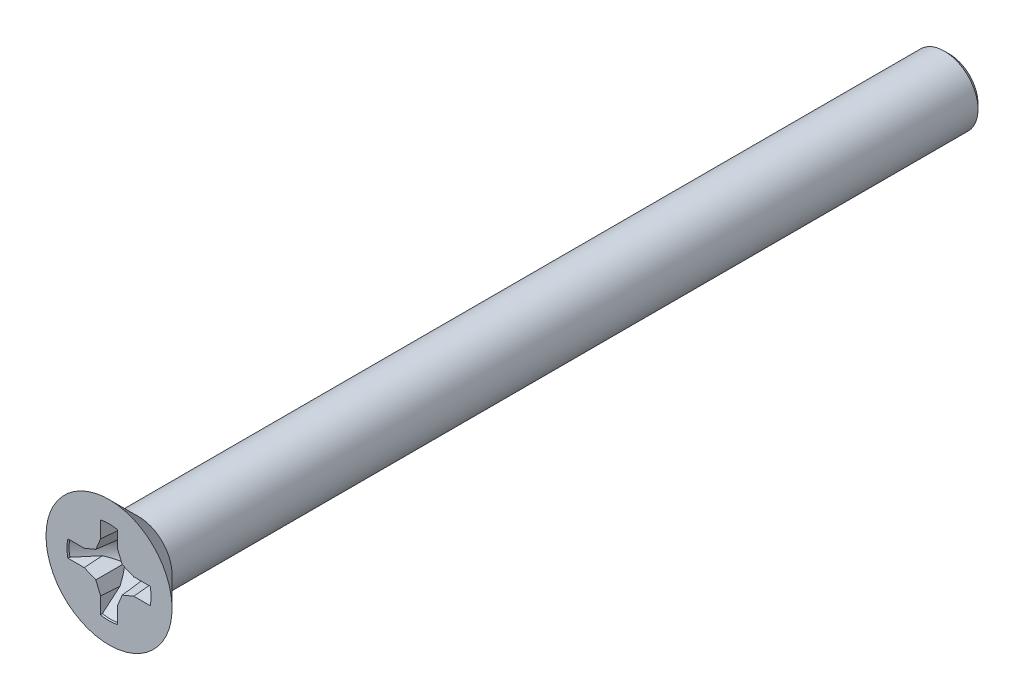
ISO-10303-21;
HEADER;
FILE_DESCRIPTION(('STEP AP214'),'2;1');
FILE_NAME('part.step','',(''),(''),'','','');
FILE_SCHEMA(('AUTOMOTIVE_DESIGN { 1 0 10303 214 1 1 1 1 }'));
ENDSEC;
DATA;
#1=APPLICATION_CONTEXT('core data for automotive mechanical design processes');
#2=APPLICATION_PROTOCOL_DEFINITION('international standard','automotive_design',2000,#1);
#3=PRODUCT_CONTEXT('',#1,'mechanical');
#4=PRODUCT('Part','Part','',(#3));
#5=PRODUCT_RELATED_PRODUCT_CATEGORY('part','',(#4));
#6=PRODUCT_DEFINITION_FORMATION('','',#4);
#7=PRODUCT_DEFINITION_CONTEXT('part definition',#1,'design');
#8=PRODUCT_DEFINITION('design','',#6,#7);
#9=PRODUCT_DEFINITION_SHAPE('','',#8);
#10=(LENGTH_UNIT() NAMED_UNIT(*) SI_UNIT(.MILLI.,.METRE.));
#11=(NAMED_UNIT(*) PLANE_ANGLE_UNIT() SI_UNIT($,.RADIAN.));
#12=(NAMED_UNIT(*) SI_UNIT($,.STERADIAN.) SOLID_ANGLE_UNIT());
#13=UNCERTAINTY_MEASURE_WITH_UNIT(LENGTH_MEASURE(1.E-05),#10,'distance_accuracy_value','');
#14=(GEOMETRIC_REPRESENTATION_CONTEXT(3) GLOBAL_UNCERTAINTY_ASSIGNED_CONTEXT((#13)) GLOBAL_UNIT_ASSIGNED_CONTEXT((#10,
#11,#12)) REPRESENTATION_CONTEXT('',''));
#15=CARTESIAN_POINT('',(0.,0.,0.));
#16=DIRECTION('',(0.,0.,1.));
#17=DIRECTION('',(1.,0.,0.));
#18=AXIS2_PLACEMENT_3D('',#15,#16,#17);
#19=CARTESIAN_POINT('',(0.500000000000026,-2.44948974278317,2.2));
#20=DIRECTION('',(-0.996194698091746,0.,0.0871557427476584));
#21=DIRECTION('',(0.,1.,0.));
#22=AXIS2_PLACEMENT_3D('',#19,#20,#21);
#23=PLANE('',#22);
#24=CARTESIAN_POINT('',(0.407324383999236,-1.45631054521119,1.14071286192047));
#25=CARTESIAN_POINT('',(0.438895455571679,-1.82218846608027,1.50157186124767));
#26=CARTESIAN_POINT('',(0.491456261529248,-2.42452511645569,2.1023446224179));
#27=(BOUNDED_CURVE() B_SPLINE_CURVE(2,(#24,#25,#26),.UNSPECIFIED.,.F.,
.F.) B_SPLINE_CURVE_WITH_KNOTS((3,3),(-0.0502307633060338,-0.0167180936561359),
.UNSPECIFIED.) CURVE() GEOMETRIC_REPRESENTATION_ITEM() RATIONAL_B_SPLINE_CURVE((2.16666900214285,
1.79889986437871,1.40255352692601)) REPRESENTATION_ITEM(''));
#28=CARTESIAN_POINT('',(0.407324383999526,-1.45631054521456,1.14071286192379));
#29=VERTEX_POINT('',#28);
#30=CARTESIAN_POINT('',(0.491456261529248,-2.42452511645569,2.1023446224179));
#31=VERTEX_POINT('',#30);
#32=EDGE_CURVE('E250',#29,#31,#27,.T.);
#33=ORIENTED_EDGE('',*,*,#32,.T.);
#34=DIRECTION('',(0.0844599239044589,-0.246790143112909,0.965381347715172));
#35=VECTOR('',#34,1.);
#36=CARTESIAN_POINT('',(0.491456261529248,-2.42452511645569,2.1023446224179));
#37=LINE('',#36,#35);
#38=CARTESIAN_POINT('',(0.500000000000026,-2.44948974278317,2.2));
#39=VERTEX_POINT('',#38);
#40=EDGE_CURVE('E316',#31,#39,#37,.T.);
#41=ORIENTED_EDGE('',*,*,#40,.T.);
#42=DIRECTION('',(0.,1.,0.));
#43=VECTOR('',#42,1.);
#44=CARTESIAN_POINT('',(0.500000000000026,-2.44948974278317,2.2));
#45=LINE('',#44,#43);
#46=CARTESIAN_POINT('',(0.500000000000016,-1.47474487139158,2.2));
#47=VERTEX_POINT('',#46);
#48=EDGE_CURVE('E265',#39,#47,#45,.T.);
#49=ORIENTED_EDGE('',*,*,#48,.T.);
#50=DIRECTION('',(0.0871426484044399,-0.0173337504938593,0.996045029063886));
#51=VECTOR('',#50,1.);
#52=CARTESIAN_POINT('',(0.500000000000016,-1.47474487139158,2.2));
#53=LINE('',#52,#51);
#54=EDGE_CURVE('E10',#29,#47,#53,.T.);
#55=ORIENTED_EDGE('',*,*,#54,.F.);
#56=EDGE_LOOP('',(#33,#41,#49,#55));
#57=FACE_BOUND('',#56,.T.);
#58=ADVANCED_FACE('F16',(#57),#23,.T.);
#59=CARTESIAN_POINT('',(0.500000000000016,-1.47474487139158,2.2));
#60=DIRECTION('',(-0.920363891963228,0.381227206369644,0.0871557427476583));
#61=DIRECTION('',(0.0942752822069814,0.,0.995546167269401));
#62=AXIS2_PLACEMENT_3D('',#59,#60,#61);
#63=PLANE('',#62);
#64=CARTESIAN_POINT('',(0.677460402999254,-0.677460402997918,0.58658499186893));
#65=CARTESIAN_POINT('',(0.568014544026815,-0.971532360593278,0.717135358188932));
#66=CARTESIAN_POINT('',(0.40732438399968,-1.4563105452141,1.14071286192338));
#67=(BOUNDED_CURVE() B_SPLINE_CURVE(2,(#64,#65,#66),.UNSPECIFIED.,.F.,
.F.) B_SPLINE_CURVE_WITH_KNOTS((3,3),(-0.314713883632195,-0.142510550070693),
.UNSPECIFIED.) CURVE() GEOMETRIC_REPRESENTATION_ITEM() RATIONAL_B_SPLINE_CURVE((2.54190043462429,
2.36011495061725,1.91562167133786)) REPRESENTATION_ITEM(''));
#68=CARTESIAN_POINT('',(0.677460402998895,-0.677460402998881,0.586584991869358));
#69=VERTEX_POINT('',#68);
#70=EDGE_CURVE('E255',#69,#29,#67,.T.);
#71=ORIENTED_EDGE('',*,*,#70,.T.);
#72=ORIENTED_EDGE('',*,*,#54,.T.);
#73=DIRECTION('',(0.38268343236508,0.923879532511291,0.));
#74=VECTOR('',#73,1.);
#75=CARTESIAN_POINT('',(0.500000000000016,-1.47474487139158,2.2));
#76=LINE('',#75,#74);
#77=CARTESIAN_POINT('',(0.785496162903796,-0.785496162903779,2.2));
#78=VERTEX_POINT('',#77);
#79=EDGE_CURVE('E270',#47,#78,#76,.T.);
#80=ORIENTED_EDGE('',*,*,#79,.T.);
#81=DIRECTION('',(0.066662691346833,-0.0666626913468316,0.995546167269401));
#82=VECTOR('',#81,1.);
#83=CARTESIAN_POINT('',(0.785496162903796,-0.785496162903779,2.2));
#84=LINE('',#83,#82);
#85=EDGE_CURVE('E27',#69,#78,#84,.T.);
#86=ORIENTED_EDGE('',*,*,#85,.F.);
#87=EDGE_LOOP('',(#71,#72,#80,#86));
#88=FACE_BOUND('',#87,.T.);
#89=ADVANCED_FACE('F986',(#88),#63,.T.);
#90=CARTESIAN_POINT('',(0.785496162903796,-0.785496162903779,2.2));
#91=DIRECTION('',(-0.381227206369663,0.92036389196322,0.0871557427476584));
#92=DIRECTION('',(0.222868776578231,0.,0.974848454082235));
#93=AXIS2_PLACEMENT_3D('',#90,#91,#92);
#94=PLANE('',#93);
#95=CARTESIAN_POINT('',(1.45631054521411,-0.407324383999649,1.14071286192338));
#96=CARTESIAN_POINT('',(0.971532360593293,-0.568014544026793,0.717135358188936));
#97=CARTESIAN_POINT('',(0.677460402997936,-0.677460402999238,0.586584991868932));
#98=(BOUNDED_CURVE() B_SPLINE_CURVE(2,(#95,#96,#97),.UNSPECIFIED.,.F.,
.F.) B_SPLINE_CURVE_WITH_KNOTS((3,3),(-0.725235736114305,-0.553032402552804),
.UNSPECIFIED.) CURVE() GEOMETRIC_REPRESENTATION_ITEM() RATIONAL_B_SPLINE_CURVE((1.91562167133786,
2.36011495061725,2.54190043462429)) REPRESENTATION_ITEM(''));
#99=CARTESIAN_POINT('',(1.45631054521457,-0.407324383999496,1.14071286192379));
#100=VERTEX_POINT('',#99);
#101=EDGE_CURVE('E278',#100,#69,#98,.T.);
#102=ORIENTED_EDGE('',*,*,#101,.T.);
#103=ORIENTED_EDGE('',*,*,#85,.T.);
#104=DIRECTION('',(0.923879532511283,0.3826834323651,0.));
#105=VECTOR('',#104,1.);
#106=CARTESIAN_POINT('',(0.785496162903796,-0.785496162903779,2.2));
#107=LINE('',#106,#105);
#108=CARTESIAN_POINT('',(1.47474487139159,-0.499999999999985,2.2));
#109=VERTEX_POINT('',#108);
#110=EDGE_CURVE('E383',#78,#109,#107,.T.);
#111=ORIENTED_EDGE('',*,*,#110,.T.);
#112=DIRECTION('',(0.0173337504938611,-0.0871426484044395,0.996045029063886));
#113=VECTOR('',#112,1.);
#114=CARTESIAN_POINT('',(1.47474487139159,-0.499999999999985,2.2));
#115=LINE('',#114,#113);
#116=EDGE_CURVE('E405',#100,#109,#115,.T.);
#117=ORIENTED_EDGE('',*,*,#116,.F.);
#118=EDGE_LOOP('',(#102,#103,#111,#117));
#119=FACE_BOUND('',#118,.T.);
#120=ADVANCED_FACE('F980',(#119),#94,.T.);
#121=CARTESIAN_POINT('',(1.47474487139159,-0.499999999999985,2.2));
#122=DIRECTION('',(0.,0.996194698091746,0.0871557427476584));
#123=DIRECTION('',(1.,0.,1.19723442951276E-13));
#124=AXIS2_PLACEMENT_3D('',#121,#122,#123);
#125=PLANE('',#124);
#126=CARTESIAN_POINT('',(2.42452511645571,-0.491456261529207,2.10234462241791));
#127=CARTESIAN_POINT('',(1.82218846608288,-0.438895455571875,1.50157186125027));
#128=CARTESIAN_POINT('',(1.45631054521457,-0.407324383999502,1.14071286192379));
#129=(BOUNDED_CURVE() B_SPLINE_CURVE(2,(#126,#127,#128),.UNSPECIFIED.,.F.,
.F.) B_SPLINE_CURVE_WITH_KNOTS((3,3),(-0.946313996596915,-0.912801326947203),
.UNSPECIFIED.) CURVE() GEOMETRIC_REPRESENTATION_ITEM() RATIONAL_B_SPLINE_CURVE((1.40255352692601,
1.79889986437651,2.16666900213877)) REPRESENTATION_ITEM(''));
#130=CARTESIAN_POINT('',(2.4245251164557,-0.491456261529198,2.1023446224179));
#131=VERTEX_POINT('',#130);
#132=EDGE_CURVE('E271',#131,#100,#129,.T.);
#133=ORIENTED_EDGE('',*,*,#132,.T.);
#134=ORIENTED_EDGE('',*,*,#116,.T.);
#135=DIRECTION('',(1.,0.,0.));
#136=VECTOR('',#135,1.);
#137=CARTESIAN_POINT('',(1.47474487139159,-0.499999999999985,2.2));
#138=LINE('',#137,#136);
#139=CARTESIAN_POINT('',(2.44948974278318,-0.499999999999975,2.2));
#140=VERTEX_POINT('',#139);
#141=EDGE_CURVE('E390',#109,#140,#138,.T.);
#142=ORIENTED_EDGE('',*,*,#141,.T.);
#143=DIRECTION('',(0.246790143112909,-0.0844599239044548,0.965381347715173));
#144=VECTOR('',#143,1.);
#145=CARTESIAN_POINT('',(2.4245251164557,-0.491456261529198,2.1023446224179));
#146=LINE('',#145,#144);
#147=EDGE_CURVE('E331',#131,#140,#146,.T.);
#148=ORIENTED_EDGE('',*,*,#147,.F.);
#149=EDGE_LOOP('',(#133,#134,#142,#148));
#150=FACE_BOUND('',#149,.T.);
#151=ADVANCED_FACE('F985',(#150),#125,.T.);
#152=CARTESIAN_POINT('',(-2.44948974278317,-0.500000000000017,2.2));
#153=DIRECTION('',(0.,0.996194698091746,0.0871557427476584));
#154=DIRECTION('',(1.,0.,0.));
#155=AXIS2_PLACEMENT_3D('',#152,#153,#154);
#156=PLANE('',#155);
#157=CARTESIAN_POINT('',(-1.4563105452112,-0.407324383999231,1.14071286192047));
#158=CARTESIAN_POINT('',(-1.82218846608027,-0.438895455571672,1.50157186124767));
#159=CARTESIAN_POINT('',(-2.42452511645569,-0.49145626152924,2.1023446224179));
#160=(BOUNDED_CURVE() B_SPLINE_CURVE(2,(#157,#158,#159),.UNSPECIFIED.,.F.,
.F.) B_SPLINE_CURVE_WITH_KNOTS((3,3),(-0.0502307633060338,-0.0167180936561359),
.UNSPECIFIED.) CURVE() GEOMETRIC_REPRESENTATION_ITEM() RATIONAL_B_SPLINE_CURVE((2.16666900214285,
1.79889986437871,1.40255352692601)) REPRESENTATION_ITEM(''));
#161=CARTESIAN_POINT('',(-1.45631054521456,-0.407324383999521,1.14071286192379));
#162=VERTEX_POINT('',#161);
#163=CARTESIAN_POINT('',(-2.42452511645569,-0.49145626152924,2.1023446224179));
#164=VERTEX_POINT('',#163);
#165=EDGE_CURVE('E303',#162,#164,#160,.T.);
#166=ORIENTED_EDGE('',*,*,#165,.T.);
#167=DIRECTION('',(-0.246790143112909,-0.0844599239044562,0.965381347715173));
#168=VECTOR('',#167,1.);
#169=CARTESIAN_POINT('',(-2.42452511645569,-0.49145626152924,2.1023446224179));
#170=LINE('',#169,#168);
#171=CARTESIAN_POINT('',(-2.44948974278317,-0.500000000000017,2.2));
#172=VERTEX_POINT('',#171);
#173=EDGE_CURVE('E400',#164,#172,#170,.T.);
#174=ORIENTED_EDGE('',*,*,#173,.T.);
#175=DIRECTION('',(1.,0.,0.));
#176=VECTOR('',#175,1.);
#177=CARTESIAN_POINT('',(-2.44948974278317,-0.500000000000017,2.2));
#178=LINE('',#177,#176);
#179=CARTESIAN_POINT('',(-1.47474487139159,-0.50000000000001,2.2));
#180=VERTEX_POINT('',#179);
#181=EDGE_CURVE('E352',#172,#180,#178,.T.);
#182=ORIENTED_EDGE('',*,*,#181,.T.);
#183=DIRECTION('',(-0.0173337504938596,-0.0871426484044398,0.996045029063886));
#184=VECTOR('',#183,1.);
#185=CARTESIAN_POINT('',(-1.47474487139159,-0.50000000000001,2.2));
#186=LINE('',#185,#184);
#187=EDGE_CURVE('E347',#162,#180,#186,.T.);
#188=ORIENTED_EDGE('',*,*,#187,.F.);
#189=EDGE_LOOP('',(#166,#174,#182,#188));
#190=FACE_BOUND('',#189,.T.);
#191=ADVANCED_FACE('F18',(#190),#156,.T.);
#192=CARTESIAN_POINT('',(-1.47474487139159,-0.50000000000001,2.2));
#193=DIRECTION('',(0.381227206369647,0.920363891963227,0.0871557427476583));
#194=DIRECTION('',(0.22286877657824,0.,-0.974848454082233));
#195=AXIS2_PLACEMENT_3D('',#192,#193,#194);
#196=PLANE('',#195);
#197=CARTESIAN_POINT('',(-0.67746040299792,-0.677460402999252,0.58658499186893));
#198=CARTESIAN_POINT('',(-0.971532360593278,-0.568014544026811,0.717135358188932));
#199=CARTESIAN_POINT('',(-1.4563105452141,-0.407324383999675,1.14071286192338));
#200=(BOUNDED_CURVE() B_SPLINE_CURVE(2,(#197,#198,#199),.UNSPECIFIED.,.F.,
.F.) B_SPLINE_CURVE_WITH_KNOTS((3,3),(-0.314713883632194,-0.142510550070693),
.UNSPECIFIED.) CURVE() GEOMETRIC_REPRESENTATION_ITEM() RATIONAL_B_SPLINE_CURVE((2.54190043462429,
2.36011495061725,1.91562167133786)) REPRESENTATION_ITEM(''));
#201=CARTESIAN_POINT('',(-0.677460402998883,-0.677460402998893,0.586584991869358));
#202=VERTEX_POINT('',#201);
#203=EDGE_CURVE('E289',#202,#162,#200,.T.);
#204=ORIENTED_EDGE('',*,*,#203,.T.);
#205=ORIENTED_EDGE('',*,*,#187,.T.);
#206=DIRECTION('',(0.92387953251129,-0.382683432365084,0.));
#207=VECTOR('',#206,1.);
#208=CARTESIAN_POINT('',(-1.47474487139159,-0.50000000000001,2.2));
#209=LINE('',#208,#207);
#210=CARTESIAN_POINT('',(-0.785496162903782,-0.785496162903793,2.2));
#211=VERTEX_POINT('',#210);
#212=EDGE_CURVE('E348',#180,#211,#209,.T.);
#213=ORIENTED_EDGE('',*,*,#212,.T.);
#214=DIRECTION('',(-0.0666626913468319,-0.0666626913468328,0.995546167269401));
#215=VECTOR('',#214,1.);
#216=CARTESIAN_POINT('',(-0.785496162903782,-0.785496162903793,2.2));
#217=LINE('',#216,#215);
#218=EDGE_CURVE('E315',#202,#211,#217,.T.);
#219=ORIENTED_EDGE('',*,*,#218,.F.);
#220=EDGE_LOOP('',(#204,#205,#213,#219));
#221=FACE_BOUND('',#220,.T.);
#222=ADVANCED_FACE('F613',(#221),#196,.T.);
#223=CARTESIAN_POINT('',(-0.785496162903782,-0.785496162903793,2.2));
#224=DIRECTION('',(0.920363891963222,0.38122720636966,0.0871557427476583));
#225=DIRECTION('',(0.,0.222868776578233,-0.974848454082234));
#226=AXIS2_PLACEMENT_3D('',#223,#224,#225);
#227=PLANE('',#226);
#228=CARTESIAN_POINT('',(-0.407324383999653,-1.45631054521411,1.14071286192339));
#229=CARTESIAN_POINT('',(-0.568014544026797,-0.971532360593289,0.717135358188932));
#230=CARTESIAN_POINT('',(-0.67746040299924,-0.67746040299793,0.58658499186893));
#231=(BOUNDED_CURVE() B_SPLINE_CURVE(2,(#228,#229,#230),.UNSPECIFIED.,.F.,
.F.) B_SPLINE_CURVE_WITH_KNOTS((3,3),(-0.725235736114305,-0.553032402552803),
.UNSPECIFIED.) CURVE() GEOMETRIC_REPRESENTATION_ITEM() RATIONAL_B_SPLINE_CURVE((1.91562167133786,
2.36011495061725,2.54190043462429)) REPRESENTATION_ITEM(''));
#232=CARTESIAN_POINT('',(-0.407324383999501,-1.45631054521457,1.14071286192379));
#233=VERTEX_POINT('',#232);
#234=EDGE_CURVE('E279',#233,#202,#231,.T.);
#235=ORIENTED_EDGE('',*,*,#234,.T.);
#236=ORIENTED_EDGE('',*,*,#218,.T.);
#237=DIRECTION('',(0.382683432365096,-0.923879532511284,0.));
#238=VECTOR('',#237,1.);
#239=CARTESIAN_POINT('',(-0.785496162903782,-0.785496162903793,2.2));
#240=LINE('',#239,#238);
#241=CARTESIAN_POINT('',(-0.49999999999999,-1.47474487139159,2.2));
#242=VERTEX_POINT('',#241);
#243=EDGE_CURVE('E353',#211,#242,#240,.T.);
#244=ORIENTED_EDGE('',*,*,#243,.T.);
#245=DIRECTION('',(-0.0871426484044396,-0.0173337504938608,0.996045029063886));
#246=VECTOR('',#245,1.);
#247=CARTESIAN_POINT('',(-0.49999999999999,-1.47474487139159,2.2));
#248=LINE('',#247,#246);
#249=EDGE_CURVE('E309',#233,#242,#248,.T.);
#250=ORIENTED_EDGE('',*,*,#249,.F.);
#251=EDGE_LOOP('',(#235,#236,#244,#250));
#252=FACE_BOUND('',#251,.T.);
#253=ADVANCED_FACE('F618',(#252),#227,.T.);
#254=CARTESIAN_POINT('',(-0.49999999999999,-1.47474487139159,2.2));
#255=DIRECTION('',(0.996194698091746,0.,0.0871557427476584));
#256=DIRECTION('',(0.,-1.,0.));
#257=AXIS2_PLACEMENT_3D('',#254,#255,#256);
#258=PLANE('',#257);
#259=CARTESIAN_POINT('',(-0.491456261529206,-2.4245251164557,2.1023446224179));
#260=CARTESIAN_POINT('',(-0.438895455571874,-1.82218846608288,1.50157186125026));
#261=CARTESIAN_POINT('',(-0.407324383999501,-1.45631054521457,1.14071286192379));
#262=(BOUNDED_CURVE() B_SPLINE_CURVE(2,(#259,#260,#261),.UNSPECIFIED.,.F.,
.F.) B_SPLINE_CURVE_WITH_KNOTS((3,3),(-0.946313996596915,-0.912801326947203),
.UNSPECIFIED.) CURVE() GEOMETRIC_REPRESENTATION_ITEM() RATIONAL_B_SPLINE_CURVE((1.40255352692601,
1.79889986437651,2.16666900213878)) REPRESENTATION_ITEM(''));
#263=CARTESIAN_POINT('',(-0.491456261529206,-2.4245251164557,2.1023446224179));
#264=VERTEX_POINT('',#263);
#265=EDGE_CURVE('E288',#264,#233,#262,.T.);
#266=ORIENTED_EDGE('',*,*,#265,.T.);
#267=ORIENTED_EDGE('',*,*,#249,.T.);
#268=DIRECTION('',(0.,-1.,0.));
#269=VECTOR('',#268,1.);
#270=CARTESIAN_POINT('',(-0.49999999999999,-1.47474487139159,2.2));
#271=LINE('',#270,#269);
#272=CARTESIAN_POINT('',(-0.499999999999983,-2.44948974278318,2.2));
#273=VERTEX_POINT('',#272);
#274=EDGE_CURVE('E417',#242,#273,#271,.T.);
#275=ORIENTED_EDGE('',*,*,#274,.T.);
#276=DIRECTION('',(-0.0844599239044562,-0.246790143112909,0.965381347715173));
#277=VECTOR('',#276,1.);
#278=CARTESIAN_POINT('',(-0.491456261529206,-2.4245251164557,2.1023446224179));
#279=LINE('',#278,#277);
#280=EDGE_CURVE('E446',#264,#273,#279,.T.);
#281=ORIENTED_EDGE('',*,*,#280,.F.);
#282=EDGE_LOOP('',(#266,#267,#275,#281));
#283=FACE_BOUND('',#282,.T.);
#284=ADVANCED_FACE('F884',(#283),#258,.T.);
#285=CARTESIAN_POINT('',(0.,0.,2.2));
#286=DIRECTION('',(0.,0.,1.));
#287=DIRECTION('',(-1.,0.,0.));
#288=AXIS2_PLACEMENT_3D('',#285,#286,#287);
#289=CONICAL_SURFACE('',#288,2.5,0.26179938779915);
#290=CARTESIAN_POINT('',(0.,0.,2.1023446224179));
#291=DIRECTION('',(0.,0.,-1.));
#292=DIRECTION('',(0.,-1.,0.));
#293=AXIS2_PLACEMENT_3D('',#290,#291,#292);
#294=CIRCLE('',#293,2.47383332044032);
#295=EDGE_CURVE('E256',#31,#264,#294,.T.);
#296=ORIENTED_EDGE('',*,*,#295,.T.);
#297=ORIENTED_EDGE('',*,*,#280,.T.);
#298=CARTESIAN_POINT('',(0.,0.,2.2));
#299=DIRECTION('',(0.,0.,1.));
#300=DIRECTION('',(-1.,0.,0.));
#301=AXIS2_PLACEMENT_3D('',#298,#299,#300);
#302=CIRCLE('',#301,2.5);
#303=EDGE_CURVE('E269',#273,#39,#302,.T.);
#304=ORIENTED_EDGE('',*,*,#303,.T.);
#305=ORIENTED_EDGE('',*,*,#40,.F.);
#306=EDGE_LOOP('',(#296,#297,#304,#305));
#307=FACE_BOUND('',#306,.T.);
#308=ADVANCED_FACE('F842',(#307),#289,.F.);
#309=CARTESIAN_POINT('',(-0.500000000000009,2.44948974278318,2.2));
#310=DIRECTION('',(0.996194698091746,0.,0.0871557427476584));
#311=DIRECTION('',(0.,-1.,0.));
#312=AXIS2_PLACEMENT_3D('',#309,#310,#311);
#313=PLANE('',#312);
#314=CARTESIAN_POINT('',(-0.407324383999231,1.4563105452112,1.14071286192047));
#315=CARTESIAN_POINT('',(-0.438895455571673,1.82218846608027,1.50157186124767));
#316=CARTESIAN_POINT('',(-0.49145626152924,2.42452511645569,2.10234462241791));
#317=(BOUNDED_CURVE() B_SPLINE_CURVE(2,(#314,#315,#316),.UNSPECIFIED.,.F.,
.F.) B_SPLINE_CURVE_WITH_KNOTS((3,3),(-0.0502307633060337,-0.0167180936561359),
.UNSPECIFIED.) CURVE() GEOMETRIC_REPRESENTATION_ITEM() RATIONAL_B_SPLINE_CURVE((2.16666900214285,
1.7988998643787,1.40255352692601)) REPRESENTATION_ITEM(''));
#318=CARTESIAN_POINT('',(-0.407324383999516,1.45631054521456,1.14071286192379));
#319=VERTEX_POINT('',#318);
#320=CARTESIAN_POINT('',(-0.491456261529231,2.42452511645569,2.1023446224179));
#321=VERTEX_POINT('',#320);
#322=EDGE_CURVE('E210',#319,#321,#317,.T.);
#323=ORIENTED_EDGE('',*,*,#322,.T.);
#324=DIRECTION('',(-0.0844599239044561,0.246790143112912,0.965381347715172));
#325=VECTOR('',#324,1.);
#326=CARTESIAN_POINT('',(-0.491456261529231,2.42452511645569,2.1023446224179));
#327=LINE('',#326,#325);
#328=CARTESIAN_POINT('',(-0.500000000000009,2.44948974278318,2.2));
#329=VERTEX_POINT('',#328);
#330=EDGE_CURVE('E204',#321,#329,#327,.T.);
#331=ORIENTED_EDGE('',*,*,#330,.T.);
#332=DIRECTION('',(0.,-1.,0.));
#333=VECTOR('',#332,1.);
#334=CARTESIAN_POINT('',(-0.500000000000009,2.44948974278318,2.2));
#335=LINE('',#334,#333);
#336=CARTESIAN_POINT('',(-0.5,1.47474487139159,2.2));
#337=VERTEX_POINT('',#336);
#338=EDGE_CURVE('E208',#329,#337,#335,.T.);
#339=ORIENTED_EDGE('',*,*,#338,.T.);
#340=DIRECTION('',(-0.0871426484044397,0.0173337504938599,0.996045029063886));
#341=VECTOR('',#340,1.);
#342=CARTESIAN_POINT('',(-0.5,1.47474487139159,2.2));
#343=LINE('',#342,#341);
#344=EDGE_CURVE('E440',#319,#337,#343,.T.);
#345=ORIENTED_EDGE('',*,*,#344,.F.);
#346=EDGE_LOOP('',(#323,#331,#339,#345));
#347=FACE_BOUND('',#346,.T.);
#348=ADVANCED_FACE('F206',(#347),#313,.T.);
#349=CARTESIAN_POINT('',(-0.5,1.47474487139159,2.2));
#350=DIRECTION('',(0.920363891963226,-0.38122720636965,0.0871557427476583));
#351=DIRECTION('',(0.,-0.222868776578239,-0.974848454082233));
#352=AXIS2_PLACEMENT_3D('',#349,#350,#351);
#353=PLANE('',#352);
#354=CARTESIAN_POINT('',(-0.677460402999248,0.677460402997922,0.58658499186893));
#355=CARTESIAN_POINT('',(-0.568014544026808,0.971532360593281,0.717135358188932));
#356=CARTESIAN_POINT('',(-0.40732438399967,1.4563105452141,1.14071286192338));
#357=(BOUNDED_CURVE() B_SPLINE_CURVE(2,(#354,#355,#356),.UNSPECIFIED.,.F.,
.F.) B_SPLINE_CURVE_WITH_KNOTS((3,3),(-0.314713883632194,-0.142510550070693),
.UNSPECIFIED.) CURVE() GEOMETRIC_REPRESENTATION_ITEM() RATIONAL_B_SPLINE_CURVE((2.54190043462429,
2.36011495061725,1.91562167133786)) REPRESENTATION_ITEM(''));
#358=CARTESIAN_POINT('',(-0.67746040299889,0.677460402998886,0.586584991869358));
#359=VERTEX_POINT('',#358);
#360=EDGE_CURVE('E358',#359,#319,#357,.T.);
#361=ORIENTED_EDGE('',*,*,#360,.T.);
#362=ORIENTED_EDGE('',*,*,#344,.T.);
#363=DIRECTION('',(-0.382683432365086,-0.923879532511288,0.));
#364=VECTOR('',#363,1.);
#365=CARTESIAN_POINT('',(-0.5,1.47474487139159,2.2));
#366=LINE('',#365,#364);
#367=CARTESIAN_POINT('',(-0.78549616290379,0.785496162903785,2.2));
#368=VERTEX_POINT('',#367);
#369=EDGE_CURVE('E231',#337,#368,#366,.T.);
#370=ORIENTED_EDGE('',*,*,#369,.T.);
#371=DIRECTION('',(-0.0666626913468326,0.0666626913468321,0.995546167269401));
#372=VECTOR('',#371,1.);
#373=CARTESIAN_POINT('',(-0.78549616290379,0.785496162903785,2.2));
#374=LINE('',#373,#372);
#375=EDGE_CURVE('E41',#359,#368,#374,.T.);
#376=ORIENTED_EDGE('',*,*,#375,.F.);
#377=EDGE_LOOP('',(#361,#362,#370,#376));
#378=FACE_BOUND('',#377,.T.);
#379=ADVANCED_FACE('F439',(#378),#353,.T.);
#380=CARTESIAN_POINT('',(-0.78549616290379,0.785496162903785,2.2));
#381=DIRECTION('',(0.381227206369657,-0.920363891963223,0.0871557427476584));
#382=DIRECTION('',(0.,-0.0942752822069821,-0.995546167269401));
#383=AXIS2_PLACEMENT_3D('',#380,#381,#382);
#384=PLANE('',#383);
#385=CARTESIAN_POINT('',(-1.4563105452141,0.40732438399966,1.14071286192338));
#386=CARTESIAN_POINT('',(-0.971532360593285,0.568014544026801,0.717135358188932));
#387=CARTESIAN_POINT('',(-0.677460402997928,0.677460402999244,0.58658499186893));
#388=(BOUNDED_CURVE() B_SPLINE_CURVE(2,(#385,#386,#387),.UNSPECIFIED.,.F.,
.F.) B_SPLINE_CURVE_WITH_KNOTS((3,3),(-0.725235736114304,-0.553032402552803),
.UNSPECIFIED.) CURVE() GEOMETRIC_REPRESENTATION_ITEM() RATIONAL_B_SPLINE_CURVE((1.91562167133786,
2.36011495061725,2.54190043462429)) REPRESENTATION_ITEM(''));
#389=CARTESIAN_POINT('',(-1.45631054521457,0.407324383999506,1.14071286192379));
#390=VERTEX_POINT('',#389);
#391=EDGE_CURVE('E330',#390,#359,#388,.T.);
#392=ORIENTED_EDGE('',*,*,#391,.T.);
#393=ORIENTED_EDGE('',*,*,#375,.T.);
#394=DIRECTION('',(-0.923879532511285,-0.382683432365093,0.));
#395=VECTOR('',#394,1.);
#396=CARTESIAN_POINT('',(-0.78549616290379,0.785496162903785,2.2));
#397=LINE('',#396,#395);
#398=CARTESIAN_POINT('',(-1.47474487139159,0.5,2.2));
#399=VERTEX_POINT('',#398);
#400=EDGE_CURVE('E261',#368,#399,#397,.T.);
#401=ORIENTED_EDGE('',*,*,#400,.T.);
#402=DIRECTION('',(-0.0173337504938605,0.0871426484044397,0.996045029063886));
#403=VECTOR('',#402,1.);
#404=CARTESIAN_POINT('',(-1.47474487139159,0.5,2.2));
#405=LINE('',#404,#403);
#406=EDGE_CURVE('E402',#390,#399,#405,.T.);
#407=ORIENTED_EDGE('',*,*,#406,.F.);
#408=EDGE_LOOP('',(#392,#393,#401,#407));
#409=FACE_BOUND('',#408,.T.);
#410=ADVANCED_FACE('F434',(#409),#384,.T.);
#411=CARTESIAN_POINT('',(-1.47474487139159,0.5,2.2));
#412=DIRECTION('',(0.,-0.996194698091746,0.0871557427476584));
#413=DIRECTION('',(-1.,0.,0.));
#414=AXIS2_PLACEMENT_3D('',#411,#412,#413);
#415=PLANE('',#414);
#416=CARTESIAN_POINT('',(-2.4245251164557,0.491456261529214,2.1023446224179));
#417=CARTESIAN_POINT('',(-1.82218846608288,0.43889545557188,1.50157186125026));
#418=CARTESIAN_POINT('',(-1.45631054521457,0.407324383999506,1.14071286192379));
#419=(BOUNDED_CURVE() B_SPLINE_CURVE(2,(#416,#417,#418),.UNSPECIFIED.,.F.,
.F.) B_SPLINE_CURVE_WITH_KNOTS((3,3),(-0.946313996596915,-0.912801326947203),
.UNSPECIFIED.) CURVE() GEOMETRIC_REPRESENTATION_ITEM() RATIONAL_B_SPLINE_CURVE((1.40255352692601,
1.79889986437651,2.16666900213878)) REPRESENTATION_ITEM(''));
#420=CARTESIAN_POINT('',(-2.4245251164557,0.491456261529215,2.1023446224179));
#421=VERTEX_POINT('',#420);
#422=EDGE_CURVE('E323',#421,#390,#419,.T.);
#423=ORIENTED_EDGE('',*,*,#422,.T.);
#424=ORIENTED_EDGE('',*,*,#406,.T.);
#425=DIRECTION('',(-1.,0.,0.));
#426=VECTOR('',#425,1.);
#427=CARTESIAN_POINT('',(-1.47474487139159,0.5,2.2));
#428=LINE('',#427,#426);
#429=CARTESIAN_POINT('',(-2.44948974278318,0.499999999999992,2.2));
#430=VERTEX_POINT('',#429);
#431=EDGE_CURVE('E264',#399,#430,#428,.T.);
#432=ORIENTED_EDGE('',*,*,#431,.T.);
#433=DIRECTION('',(-0.246790143112904,0.0844599239044577,0.965381347715174));
#434=VECTOR('',#433,1.);
#435=CARTESIAN_POINT('',(-2.4245251164557,0.491456261529215,2.1023446224179));
#436=LINE('',#435,#434);
#437=EDGE_CURVE('E397',#421,#430,#436,.T.);
#438=ORIENTED_EDGE('',*,*,#437,.F.);
#439=EDGE_LOOP('',(#423,#424,#432,#438));
#440=FACE_BOUND('',#439,.T.);
#441=ADVANCED_FACE('F865',(#440),#415,.T.);
#442=CARTESIAN_POINT('',(0.,0.,2.2));
#443=DIRECTION('',(0.,0.,1.));
#444=DIRECTION('',(0.,1.,0.));
#445=AXIS2_PLACEMENT_3D('',#442,#443,#444);
#446=CONICAL_SURFACE('',#445,2.5,0.26179938779915);
#447=CARTESIAN_POINT('',(0.,0.,2.1023446224179));
#448=DIRECTION('',(0.,0.,-1.));
#449=DIRECTION('',(0.,-1.,0.));
#450=AXIS2_PLACEMENT_3D('',#447,#448,#449);
#451=CIRCLE('',#450,2.47383332044032);
#452=CARTESIAN_POINT('',(-2.47383332044033,0.,2.10234462241791));
#453=VERTEX_POINT('',#452);
#454=EDGE_CURVE('E243',#164,#453,#451,.T.);
#455=ORIENTED_EDGE('',*,*,#454,.T.);
#456=CARTESIAN_POINT('',(0.,0.,2.1023446224179));
#457=DIRECTION('',(0.,0.,-1.));
#458=DIRECTION('',(0.,-1.,0.));
#459=AXIS2_PLACEMENT_3D('',#456,#457,#458);
#460=CIRCLE('',#459,2.47383332044032);
#461=EDGE_CURVE('E329',#453,#421,#460,.T.);
#462=ORIENTED_EDGE('',*,*,#461,.T.);
#463=ORIENTED_EDGE('',*,*,#437,.T.);
#464=CARTESIAN_POINT('',(0.,0.,2.2));
#465=DIRECTION('',(0.,0.,1.));
#466=DIRECTION('',(0.,1.,0.));
#467=AXIS2_PLACEMENT_3D('',#464,#465,#466);
#468=CIRCLE('',#467,2.5);
#469=EDGE_CURVE('E374',#430,#172,#468,.T.);
#470=ORIENTED_EDGE('',*,*,#469,.T.);
#471=ORIENTED_EDGE('',*,*,#173,.F.);
#472=EDGE_LOOP('',(#455,#462,#463,#470,#471));
#473=FACE_BOUND('',#472,.T.);
#474=ADVANCED_FACE('F608',(#473),#446,.F.);
#475=CARTESIAN_POINT('',(2.44948974278318,0.5,2.2));
#476=DIRECTION('',(0.,-0.996194698091746,0.0871557427476584));
#477=DIRECTION('',(-1.,0.,0.));
#478=AXIS2_PLACEMENT_3D('',#475,#476,#477);
#479=PLANE('',#478);
#480=CARTESIAN_POINT('',(1.45631054521456,0.407324383999511,1.14071286192379));
#481=CARTESIAN_POINT('',(1.82218846608287,0.438895455571887,1.50157186125026));
#482=CARTESIAN_POINT('',(2.42452511645569,0.491456261529224,2.1023446224179));
#483=(BOUNDED_CURVE() B_SPLINE_CURVE(2,(#480,#481,#482),.UNSPECIFIED.,.F.,
.F.) B_SPLINE_CURVE_WITH_KNOTS((3,3),(0.912801326947203,0.946313996596915),
.UNSPECIFIED.) CURVE() GEOMETRIC_REPRESENTATION_ITEM() RATIONAL_B_SPLINE_CURVE((2.16666900213878,
1.79889986437651,1.40255352692601)) REPRESENTATION_ITEM(''));
#484=CARTESIAN_POINT('',(1.45631054521456,0.407324383999511,1.14071286192379));
#485=VERTEX_POINT('',#484);
#486=CARTESIAN_POINT('',(2.4245251164557,0.491456261529223,2.1023446224179));
#487=VERTEX_POINT('',#486);
#488=EDGE_CURVE('E382',#485,#487,#483,.T.);
#489=ORIENTED_EDGE('',*,*,#488,.T.);
#490=DIRECTION('',(0.246790143112909,0.0844599239044548,0.965381347715173));
#491=VECTOR('',#490,1.);
#492=CARTESIAN_POINT('',(2.4245251164557,0.491456261529223,2.1023446224179));
#493=LINE('',#492,#491);
#494=CARTESIAN_POINT('',(2.44948974278318,0.5,2.2));
#495=VERTEX_POINT('',#494);
#496=EDGE_CURVE('E298',#487,#495,#493,.T.);
#497=ORIENTED_EDGE('',*,*,#496,.T.);
#498=DIRECTION('',(-1.,0.,0.));
#499=VECTOR('',#498,1.);
#500=CARTESIAN_POINT('',(2.44948974278318,0.5,2.2));
#501=LINE('',#500,#499);
#502=CARTESIAN_POINT('',(1.47474487139159,0.5,2.2));
#503=VERTEX_POINT('',#502);
#504=EDGE_CURVE('E20',#495,#503,#501,.T.);
#505=ORIENTED_EDGE('',*,*,#504,.T.);
#506=DIRECTION('',(0.0173337504938602,0.0871426484044397,0.996045029063886));
#507=VECTOR('',#506,1.);
#508=CARTESIAN_POINT('',(1.47474487139159,0.5,2.2));
#509=LINE('',#508,#507);
#510=EDGE_CURVE('E401',#485,#503,#509,.T.);
#511=ORIENTED_EDGE('',*,*,#510,.F.);
#512=EDGE_LOOP('',(#489,#497,#505,#511));
#513=FACE_BOUND('',#512,.T.);
#514=ADVANCED_FACE('F876',(#513),#479,.T.);
#515=CARTESIAN_POINT('',(1.47474487139159,0.5,2.2));
#516=DIRECTION('',(-0.381227206369653,-0.920363891963224,0.0871557427476585));
#517=DIRECTION('',(-0.923879532511287,0.38268343236509,0.));
#518=AXIS2_PLACEMENT_3D('',#515,#516,#517);
#519=PLANE('',#518);
#520=CARTESIAN_POINT('',(0.677460402997926,0.677460402999246,0.58658499186893));
#521=CARTESIAN_POINT('',(0.971532360593285,0.568014544026804,0.717135358188934));
#522=CARTESIAN_POINT('',(1.4563105452141,0.407324383999664,1.14071286192338));
#523=(BOUNDED_CURVE() B_SPLINE_CURVE(2,(#520,#521,#522),.UNSPECIFIED.,.F.,
.F.) B_SPLINE_CURVE_WITH_KNOTS((3,3),(0.553032402552804,0.725235736114305),
.UNSPECIFIED.) CURVE() GEOMETRIC_REPRESENTATION_ITEM() RATIONAL_B_SPLINE_CURVE((2.54190043462429,
2.36011495061725,1.91562167133786)) REPRESENTATION_ITEM(''));
#524=CARTESIAN_POINT('',(0.677460402998888,0.677460402998888,0.586584991869358));
#525=VERTEX_POINT('',#524);
#526=EDGE_CURVE('E375',#525,#485,#523,.T.);
#527=ORIENTED_EDGE('',*,*,#526,.T.);
#528=ORIENTED_EDGE('',*,*,#510,.T.);
#529=DIRECTION('',(-0.923879532511287,0.38268343236509,0.));
#530=VECTOR('',#529,1.);
#531=CARTESIAN_POINT('',(1.47474487139159,0.5,2.2));
#532=LINE('',#531,#530);
#533=CARTESIAN_POINT('',(0.785496162903787,0.785496162903787,2.2));
#534=VERTEX_POINT('',#533);
#535=EDGE_CURVE('E297',#503,#534,#532,.T.);
#536=ORIENTED_EDGE('',*,*,#535,.T.);
#537=DIRECTION('',(0.0666626913468323,0.0666626913468323,0.995546167269401));
#538=VECTOR('',#537,1.);
#539=CARTESIAN_POINT('',(0.785496162903787,0.785496162903787,2.2));
#540=LINE('',#539,#538);
#541=EDGE_CURVE('E393',#525,#534,#540,.T.);
#542=ORIENTED_EDGE('',*,*,#541,.F.);
#543=EDGE_LOOP('',(#527,#528,#536,#542));
#544=FACE_BOUND('',#543,.T.);
#545=ADVANCED_FACE('F515',(#544),#519,.T.);
#546=CARTESIAN_POINT('',(0.785496162903787,0.785496162903787,2.2));
#547=DIRECTION('',(-0.920363891963224,-0.381227206369654,0.0871557427476584));
#548=DIRECTION('',(-0.382683432365091,0.923879532511287,0.));
#549=AXIS2_PLACEMENT_3D('',#546,#547,#548);
#550=PLANE('',#549);
#551=CARTESIAN_POINT('',(0.407324383999664,1.4563105452141,1.14071286192338));
#552=CARTESIAN_POINT('',(0.568014544026804,0.971532360593282,0.717135358188932));
#553=CARTESIAN_POINT('',(0.677460402999246,0.677460402997926,0.58658499186893));
#554=(BOUNDED_CURVE() B_SPLINE_CURVE(2,(#551,#552,#553),.UNSPECIFIED.,.F.,
.F.) B_SPLINE_CURVE_WITH_KNOTS((3,3),(0.142510550070693,0.314713883632194),
.UNSPECIFIED.) CURVE() GEOMETRIC_REPRESENTATION_ITEM() RATIONAL_B_SPLINE_CURVE((1.91562167133786,
2.36011495061725,2.54190043462429)) REPRESENTATION_ITEM(''));
#555=CARTESIAN_POINT('',(0.407324383999511,1.45631054521456,1.14071286192379));
#556=VERTEX_POINT('',#555);
#557=EDGE_CURVE('E381',#556,#525,#554,.T.);
#558=ORIENTED_EDGE('',*,*,#557,.T.);
#559=ORIENTED_EDGE('',*,*,#541,.T.);
#560=DIRECTION('',(-0.38268343236509,0.923879532511287,0.));
#561=VECTOR('',#560,1.);
#562=CARTESIAN_POINT('',(0.785496162903787,0.785496162903787,2.2));
#563=LINE('',#562,#561);
#564=CARTESIAN_POINT('',(0.5,1.47474487139159,2.2));
#565=VERTEX_POINT('',#564);
#566=EDGE_CURVE('E290',#534,#565,#563,.T.);
#567=ORIENTED_EDGE('',*,*,#566,.T.);
#568=DIRECTION('',(0.0871426484044397,0.0173337504938602,0.996045029063886));
#569=VECTOR('',#568,1.);
#570=CARTESIAN_POINT('',(0.5,1.47474487139159,2.2));
#571=LINE('',#570,#569);
#572=EDGE_CURVE('E215',#556,#565,#571,.T.);
#573=ORIENTED_EDGE('',*,*,#572,.F.);
#574=EDGE_LOOP('',(#558,#559,#567,#573));
#575=FACE_BOUND('',#574,.T.);
#576=ADVANCED_FACE('F503',(#575),#550,.T.);
#577=CARTESIAN_POINT('',(0.5,1.47474487139159,2.2));
#578=DIRECTION('',(-0.996194698091746,0.,0.0871557427476584));
#579=DIRECTION('',(0.,1.,0.));
#580=AXIS2_PLACEMENT_3D('',#577,#578,#579);
#581=PLANE('',#580);
#582=CARTESIAN_POINT('',(0.491456261529224,2.4245251164557,2.1023446224179));
#583=CARTESIAN_POINT('',(0.43889545557166,1.82218846608027,1.50157186124767));
#584=CARTESIAN_POINT('',(0.40732438399922,1.4563105452112,1.14071286192047));
#585=(BOUNDED_CURVE() B_SPLINE_CURVE(2,(#582,#583,#584),.UNSPECIFIED.,.F.,
.F.) B_SPLINE_CURVE_WITH_KNOTS((3,3),(0.0167180936561359,0.0502307633060338),
.UNSPECIFIED.) CURVE() GEOMETRIC_REPRESENTATION_ITEM() RATIONAL_B_SPLINE_CURVE((1.40255352692601,
1.79889986437871,2.16666900214285)) REPRESENTATION_ITEM(''));
#586=CARTESIAN_POINT('',(0.491456261529223,2.4245251164557,2.1023446224179));
#587=VERTEX_POINT('',#586);
#588=EDGE_CURVE('E423',#587,#556,#585,.T.);
#589=ORIENTED_EDGE('',*,*,#588,.T.);
#590=ORIENTED_EDGE('',*,*,#572,.T.);
#591=DIRECTION('',(0.,1.,0.));
#592=VECTOR('',#591,1.);
#593=CARTESIAN_POINT('',(0.5,1.47474487139159,2.2));
#594=LINE('',#593,#592);
#595=CARTESIAN_POINT('',(0.5,2.44948974278318,2.2));
#596=VERTEX_POINT('',#595);
#597=EDGE_CURVE('E225',#565,#596,#594,.T.);
#598=ORIENTED_EDGE('',*,*,#597,.T.);
#599=DIRECTION('',(0.0844599239044597,0.246790143112907,0.965381347715173));
#600=VECTOR('',#599,1.);
#601=CARTESIAN_POINT('',(0.491456261529223,2.4245251164557,2.1023446224179));
#602=LINE('',#601,#600);
#603=EDGE_CURVE('E216',#587,#596,#602,.T.);
#604=ORIENTED_EDGE('',*,*,#603,.F.);
#605=EDGE_LOOP('',(#589,#590,#598,#604));
#606=FACE_BOUND('',#605,.T.);
#607=ADVANCED_FACE('F509',(#606),#581,.T.);
#608=CARTESIAN_POINT('',(0.,0.,2.2));
#609=DIRECTION('',(0.,0.,1.));
#610=DIRECTION('',(1.,0.,0.));
#611=AXIS2_PLACEMENT_3D('',#608,#609,#610);
#612=CONICAL_SURFACE('',#611,2.5,0.26179938779915);
#613=CARTESIAN_POINT('',(0.,0.,2.1023446224179));
#614=DIRECTION('',(0.,0.,-1.));
#615=DIRECTION('',(0.,-1.,0.));
#616=AXIS2_PLACEMENT_3D('',#613,#614,#615);
#617=CIRCLE('',#616,2.47383332044032);
#618=EDGE_CURVE('E359',#321,#587,#617,.T.);
#619=ORIENTED_EDGE('',*,*,#618,.T.);
#620=ORIENTED_EDGE('',*,*,#603,.T.);
#621=CARTESIAN_POINT('',(0.,0.,2.2));
#622=DIRECTION('',(0.,0.,1.));
#623=DIRECTION('',(1.,0.,0.));
#624=AXIS2_PLACEMENT_3D('',#621,#622,#623);
#625=CIRCLE('',#624,2.5);
#626=EDGE_CURVE('E219',#596,#329,#625,.T.);
#627=ORIENTED_EDGE('',*,*,#626,.T.);
#628=ORIENTED_EDGE('',*,*,#330,.F.);
#629=EDGE_LOOP('',(#619,#620,#627,#628));
#630=FACE_BOUND('',#629,.T.);
#631=ADVANCED_FACE('F220',(#630),#612,.F.);
#632=CARTESIAN_POINT('',(0.,2.,2.2));
#633=DIRECTION('',(0.,0.,-1.));
#634=DIRECTION('',(0.,-1.,0.));
#635=AXIS2_PLACEMENT_3D('',#632,#633,#634);
#636=PLANE('',#635);
#637=ORIENTED_EDGE('',*,*,#338,.F.);
#638=ORIENTED_EDGE('',*,*,#626,.F.);
#639=ORIENTED_EDGE('',*,*,#597,.F.);
#640=ORIENTED_EDGE('',*,*,#566,.F.);
#641=ORIENTED_EDGE('',*,*,#535,.F.);
#642=ORIENTED_EDGE('',*,*,#504,.F.);
#643=CARTESIAN_POINT('',(0.,0.,2.2));
#644=DIRECTION('',(0.,0.,1.));
#645=DIRECTION('',(1.,0.,0.));
#646=AXIS2_PLACEMENT_3D('',#643,#644,#645);
#647=CIRCLE('',#646,2.5);
#648=EDGE_CURVE('E302',#140,#495,#647,.T.);
#649=ORIENTED_EDGE('',*,*,#648,.F.);
#650=ORIENTED_EDGE('',*,*,#141,.F.);
#651=ORIENTED_EDGE('',*,*,#110,.F.);
#652=ORIENTED_EDGE('',*,*,#79,.F.);
#653=ORIENTED_EDGE('',*,*,#48,.F.);
#654=ORIENTED_EDGE('',*,*,#303,.F.);
#655=ORIENTED_EDGE('',*,*,#274,.F.);
#656=ORIENTED_EDGE('',*,*,#243,.F.);
#657=ORIENTED_EDGE('',*,*,#212,.F.);
#658=ORIENTED_EDGE('',*,*,#181,.F.);
#659=ORIENTED_EDGE('',*,*,#469,.F.);
#660=ORIENTED_EDGE('',*,*,#431,.F.);
#661=ORIENTED_EDGE('',*,*,#400,.F.);
#662=ORIENTED_EDGE('',*,*,#369,.F.);
#663=EDGE_LOOP('',(#637,#638,#639,#640,#641,#642,#649,#650,#651,#652,#653,#654,#655,#656,#657,
#658,#659,#660,#661,#662));
#664=FACE_BOUND('',#663,.T.);
#665=CARTESIAN_POINT('',(0.,0.,2.2));
#666=DIRECTION('',(0.,0.,-1.));
#667=DIRECTION('',(-1.,0.,0.));
#668=AXIS2_PLACEMENT_3D('',#665,#666,#667);
#669=CIRCLE('',#668,3.75);
#670=CARTESIAN_POINT('',(-3.75,0.,2.2));
#671=VERTEX_POINT('',#670);
#672=EDGE_CURVE('E239',#671,#671,#669,.T.);
#673=ORIENTED_EDGE('',*,*,#672,.F.);
#674=EDGE_LOOP('',(#673));
#675=FACE_BOUND('',#674,.T.);
#676=ADVANCED_FACE('F228',(#664,#675),#636,.F.);
#677=CARTESIAN_POINT('',(0.,0.,2.2));
#678=DIRECTION('',(0.,0.,1.));
#679=DIRECTION('',(1.,0.,0.));
#680=AXIS2_PLACEMENT_3D('',#677,#678,#679);
#681=CONICAL_SURFACE('',#680,3.75,0.78539816339745);
#682=ORIENTED_EDGE('',*,*,#672,.T.);
#683=DIRECTION('',(0.707106781186549,0.,-0.707106781186546));
#684=VECTOR('',#683,1.);
#685=CARTESIAN_POINT('',(-3.75,0.,2.2));
#686=LINE('',#685,#684);
#687=CARTESIAN_POINT('',(-2.,0.,0.450000000000008));
#688=VERTEX_POINT('',#687);
#689=EDGE_CURVE('E233',#671,#688,#686,.T.);
#690=ORIENTED_EDGE('',*,*,#689,.T.);
#691=CARTESIAN_POINT('',(0.,0.,0.450000000000008));
#692=DIRECTION('',(0.,0.,-1.));
#693=DIRECTION('',(1.,0.,0.));
#694=AXIS2_PLACEMENT_3D('',#691,#692,#693);
#695=CIRCLE('',#694,2.);
#696=CARTESIAN_POINT('',(0.,2.,0.450000000000008));
#697=VERTEX_POINT('',#696);
#698=EDGE_CURVE('E321',#697,#688,#695,.T.);
#699=ORIENTED_EDGE('',*,*,#698,.F.);
#700=CARTESIAN_POINT('',(0.,0.,0.450000000000008));
#701=DIRECTION('',(0.,0.,-1.));
#702=DIRECTION('',(1.,0.,0.));
#703=AXIS2_PLACEMENT_3D('',#700,#701,#702);
#704=CIRCLE('',#703,2.);
#705=EDGE_CURVE('E248',#688,#697,#704,.T.);
#706=ORIENTED_EDGE('',*,*,#705,.F.);
#707=ORIENTED_EDGE('',*,*,#689,.F.);
#708=EDGE_LOOP('',(#682,#690,#699,#706,#707));
#709=FACE_BOUND('',#708,.T.);
#710=ADVANCED_FACE('F899',(#709),#681,.T.);
#711=CARTESIAN_POINT('',(0.,0.,2.2));
#712=DIRECTION('',(0.,0.,1.));
#713=DIRECTION('',(1.,0.,0.));
#714=AXIS2_PLACEMENT_3D('',#711,#712,#713);
#715=CONICAL_SURFACE('',#714,2.5,0.26179938779915);
#716=CARTESIAN_POINT('',(0.,0.,2.1023446224179));
#717=DIRECTION('',(0.,0.,-1.));
#718=DIRECTION('',(0.,-1.,0.));
#719=AXIS2_PLACEMENT_3D('',#716,#717,#718);
#720=CIRCLE('',#719,2.47383332044032);
#721=EDGE_CURVE('E277',#487,#131,#720,.T.);
#722=ORIENTED_EDGE('',*,*,#721,.T.);
#723=ORIENTED_EDGE('',*,*,#147,.T.);
#724=ORIENTED_EDGE('',*,*,#648,.T.);
#725=ORIENTED_EDGE('',*,*,#496,.F.);
#726=EDGE_LOOP('',(#722,#723,#724,#725));
#727=FACE_BOUND('',#726,.T.);
#728=ADVANCED_FACE('F478',(#727),#715,.F.);
#729=CARTESIAN_POINT('',(0.,0.,2.78925565098879));
#730=DIRECTION('',(0.,0.,1.));
#731=DIRECTION('',(1.,0.,0.));
#732=AXIS2_PLACEMENT_3D('',#729,#730,#731);
#733=CONICAL_SURFACE('',#732,3.16074434901121,0.78539816339745);
#734=DIRECTION('',(-0.707106781186549,0.,0.707106781186546));
#735=VECTOR('',#734,1.);
#736=CARTESIAN_POINT('',(-3.16074434901121,0.,2.78925565098879));
#737=LINE('',#736,#735);
#738=CARTESIAN_POINT('',(0.,0.,-0.371488698022408));
#739=VERTEX_POINT('',#738);
#740=EDGE_CURVE('E247',#739,#453,#737,.T.);
#741=ORIENTED_EDGE('',*,*,#740,.T.);
#742=ORIENTED_EDGE('',*,*,#454,.F.);
#743=ORIENTED_EDGE('',*,*,#165,.F.);
#744=ORIENTED_EDGE('',*,*,#203,.F.);
#745=ORIENTED_EDGE('',*,*,#234,.F.);
#746=ORIENTED_EDGE('',*,*,#265,.F.);
#747=ORIENTED_EDGE('',*,*,#295,.F.);
#748=ORIENTED_EDGE('',*,*,#32,.F.);
#749=ORIENTED_EDGE('',*,*,#70,.F.);
#750=ORIENTED_EDGE('',*,*,#101,.F.);
#751=ORIENTED_EDGE('',*,*,#132,.F.);
#752=ORIENTED_EDGE('',*,*,#721,.F.);
#753=ORIENTED_EDGE('',*,*,#488,.F.);
#754=ORIENTED_EDGE('',*,*,#526,.F.);
#755=ORIENTED_EDGE('',*,*,#557,.F.);
#756=ORIENTED_EDGE('',*,*,#588,.F.);
#757=ORIENTED_EDGE('',*,*,#618,.F.);
#758=ORIENTED_EDGE('',*,*,#322,.F.);
#759=ORIENTED_EDGE('',*,*,#360,.F.);
#760=ORIENTED_EDGE('',*,*,#391,.F.);
#761=ORIENTED_EDGE('',*,*,#422,.F.);
#762=ORIENTED_EDGE('',*,*,#461,.F.);
#763=ORIENTED_EDGE('',*,*,#740,.F.);
#764=EDGE_LOOP('',(#741,#742,#743,#744,#745,#746,#747,#748,#749,#750,#751,#752,#753,#754,#755,
#756,#757,#758,#759,#760,#761,#762,#763));
#765=FACE_BOUND('',#764,.T.);
#766=ADVANCED_FACE('F437',(#765),#733,.F.);
#767=CARTESIAN_POINT('',(0.,0.,-47.8));
#768=DIRECTION('',(0.,0.,1.));
#769=DIRECTION('',(0.,-1.,0.));
#770=AXIS2_PLACEMENT_3D('',#767,#768,#769);
#771=PLANE('',#770);
#772=CARTESIAN_POINT('',(0.,0.,-47.8));
#773=DIRECTION('',(0.,0.,1.));
#774=DIRECTION('',(0.,-1.,0.));
#775=AXIS2_PLACEMENT_3D('',#772,#773,#774);
#776=CIRCLE('',#775,1.7);
#777=CARTESIAN_POINT('',(0.,1.7,-47.8));
#778=VERTEX_POINT('',#777);
#779=EDGE_CURVE('E421',#778,#778,#776,.T.);
#780=ORIENTED_EDGE('',*,*,#779,.F.);
#781=EDGE_LOOP('',(#780));
#782=FACE_BOUND('',#781,.T.);
#783=ADVANCED_FACE('F829',(#782),#771,.F.);
#784=CARTESIAN_POINT('',(0.,0.,2.2));
#785=DIRECTION('',(0.,0.,1.));
#786=DIRECTION('',(0.,-1.,0.));
#787=AXIS2_PLACEMENT_3D('',#784,#785,#786);
#788=CYLINDRICAL_SURFACE('',#787,2.);
#789=ORIENTED_EDGE('',*,*,#698,.T.);
#790=ORIENTED_EDGE('',*,*,#705,.T.);
#791=DIRECTION('',(0.,0.,-1.));
#792=VECTOR('',#791,1.);
#793=CARTESIAN_POINT('',(0.,2.,2.2));
#794=LINE('',#793,#792);
#795=CARTESIAN_POINT('',(0.,2.,-47.5));
#796=VERTEX_POINT('',#795);
#797=EDGE_CURVE('E245',#697,#796,#794,.T.);
#798=ORIENTED_EDGE('',*,*,#797,.T.);
#799=CARTESIAN_POINT('',(0.,0.,-47.5));
#800=DIRECTION('',(0.,0.,-1.));
#801=DIRECTION('',(0.,-1.,0.));
#802=AXIS2_PLACEMENT_3D('',#799,#800,#801);
#803=CIRCLE('',#802,2.);
#804=EDGE_CURVE('E317',#796,#796,#803,.T.);
#805=ORIENTED_EDGE('',*,*,#804,.F.);
#806=ORIENTED_EDGE('',*,*,#797,.F.);
#807=EDGE_LOOP('',(#789,#790,#798,#805,#806));
#808=FACE_BOUND('',#807,.T.);
#809=ADVANCED_FACE('F932',(#808),#788,.T.);
#810=CARTESIAN_POINT('',(0.,0.,-47.65));
#811=DIRECTION('',(0.,0.,1.));
#812=DIRECTION('',(0.,-1.,0.));
#813=AXIS2_PLACEMENT_3D('',#810,#811,#812);
#814=CONICAL_SURFACE('',#813,1.85,0.785398163397439);
#815=ORIENTED_EDGE('',*,*,#779,.T.);
#816=DIRECTION('',(0.,0.707106781186541,0.707106781186554));
#817=VECTOR('',#816,1.);
#818=CARTESIAN_POINT('',(0.,1.85,-47.65));
#819=LINE('',#818,#817);
#820=EDGE_CURVE('E322',#778,#796,#819,.T.);
#821=ORIENTED_EDGE('',*,*,#820,.T.);
#822=ORIENTED_EDGE('',*,*,#804,.T.);
#823=ORIENTED_EDGE('',*,*,#820,.F.);
#824=EDGE_LOOP('',(#815,#821,#822,#823));
#825=FACE_BOUND('',#824,.T.);
#826=ADVANCED_FACE('F937',(#825),#814,.T.);
#827=CLOSED_SHELL('',(#58,#89,#120,#151,#191,#222,#253,#284,#308,#348,#379,#410,#441,#474,#514,
#545,#576,#607,#631,#676,#710,#728,#766,#783,#809,#826));
#828=MANIFOLD_SOLID_BREP('B1',#827);
#829=ADVANCED_BREP_SHAPE_REPRESENTATION('',(#18,#828),#14);
#830=SHAPE_DEFINITION_REPRESENTATION(#9,#829);
ENDSEC;
END-ISO-10303-21;
